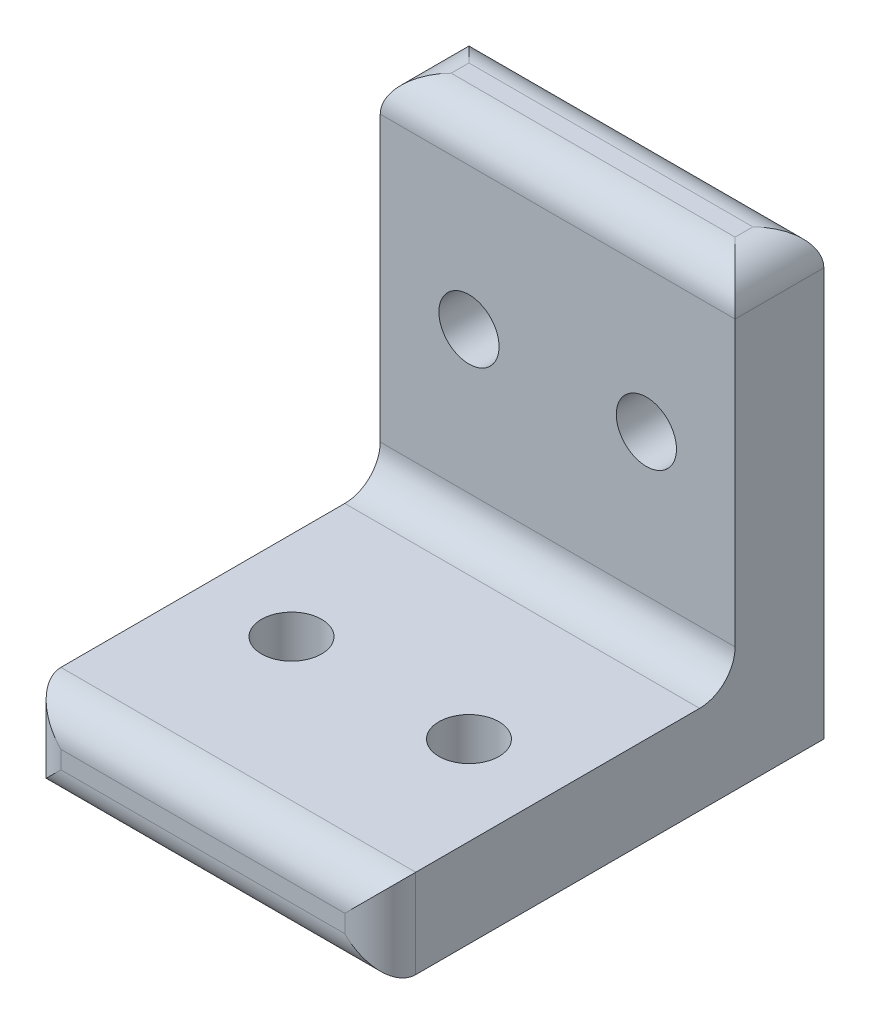
ISO-10303-21;
HEADER;
FILE_DESCRIPTION(('STEP AP214'),'2;1');
FILE_NAME('part.step','',(''),(''),'','','');
FILE_SCHEMA(('AUTOMOTIVE_DESIGN { 1 0 10303 214 1 1 1 1 }'));
ENDSEC;
DATA;
#1=APPLICATION_CONTEXT('core data for automotive mechanical design processes');
#2=APPLICATION_PROTOCOL_DEFINITION('international standard','automotive_design',2000,#1);
#3=PRODUCT_CONTEXT('',#1,'mechanical');
#4=PRODUCT('Part','Part','',(#3));
#5=PRODUCT_RELATED_PRODUCT_CATEGORY('part','',(#4));
#6=PRODUCT_DEFINITION_FORMATION('','',#4);
#7=PRODUCT_DEFINITION_CONTEXT('part definition',#1,'design');
#8=PRODUCT_DEFINITION('design','',#6,#7);
#9=PRODUCT_DEFINITION_SHAPE('','',#8);
#10=(LENGTH_UNIT() NAMED_UNIT(*) SI_UNIT(.MILLI.,.METRE.));
#11=(NAMED_UNIT(*) PLANE_ANGLE_UNIT() SI_UNIT($,.RADIAN.));
#12=(NAMED_UNIT(*) SI_UNIT($,.STERADIAN.) SOLID_ANGLE_UNIT());
#13=UNCERTAINTY_MEASURE_WITH_UNIT(LENGTH_MEASURE(1.E-05),#10,'distance_accuracy_value','');
#14=(GEOMETRIC_REPRESENTATION_CONTEXT(3) GLOBAL_UNCERTAINTY_ASSIGNED_CONTEXT((#13)) GLOBAL_UNIT_ASSIGNED_CONTEXT((#10,
#11,#12)) REPRESENTATION_CONTEXT('',''));
#15=CARTESIAN_POINT('',(0.,0.,0.));
#16=DIRECTION('',(0.,0.,1.));
#17=DIRECTION('',(1.,0.,0.));
#18=AXIS2_PLACEMENT_3D('',#15,#16,#17);
#19=CARTESIAN_POINT('',(0.,0.,0.));
#20=DIRECTION('',(0.,-1.,0.));
#21=DIRECTION('',(0.,0.,-1.));
#22=AXIS2_PLACEMENT_3D('',#19,#20,#21);
#23=PLANE('',#22);
#24=DIRECTION('',(0.,0.,-1.));
#25=VECTOR('',#24,1.);
#26=CARTESIAN_POINT('',(12.7,0.,12.7));
#27=LINE('',#26,#25);
#28=CARTESIAN_POINT('',(12.7,0.,10.16));
#29=VERTEX_POINT('',#28);
#30=CARTESIAN_POINT('',(12.7,0.,-19.05));
#31=VERTEX_POINT('',#30);
#32=EDGE_CURVE('E139',#29,#31,#27,.T.);
#33=ORIENTED_EDGE('',*,*,#32,.F.);
#34=DIRECTION('',(1.,0.,0.));
#35=VECTOR('',#34,1.);
#36=CARTESIAN_POINT('',(-12.7,0.,10.16));
#37=LINE('',#36,#35);
#38=CARTESIAN_POINT('',(-12.7,0.,10.16));
#39=VERTEX_POINT('',#38);
#40=EDGE_CURVE('E197',#29,#39,#37,.F.);
#41=ORIENTED_EDGE('',*,*,#40,.T.);
#42=DIRECTION('',(0.,0.,1.));
#43=VECTOR('',#42,1.);
#44=CARTESIAN_POINT('',(-12.7,0.,12.7));
#45=LINE('',#44,#43);
#46=CARTESIAN_POINT('',(-12.7,0.,-19.05));
#47=VERTEX_POINT('',#46);
#48=EDGE_CURVE('E146',#47,#39,#45,.T.);
#49=ORIENTED_EDGE('',*,*,#48,.F.);
#50=DIRECTION('',(-1.,0.,0.));
#51=VECTOR('',#50,1.);
#52=CARTESIAN_POINT('',(12.7,0.,-19.05));
#53=LINE('',#52,#51);
#54=EDGE_CURVE('E130',#31,#47,#53,.T.);
#55=ORIENTED_EDGE('',*,*,#54,.F.);
#56=EDGE_LOOP('',(#33,#41,#49,#55));
#57=FACE_BOUND('',#56,.T.);
#58=CARTESIAN_POINT('',(6.35,0.,0.));
#59=DIRECTION('',(0.,1.,0.));
#60=DIRECTION('',(0.,0.,1.));
#61=AXIS2_PLACEMENT_3D('',#58,#59,#60);
#62=CIRCLE('',#61,2.15265);
#63=CARTESIAN_POINT('',(6.35,0.,2.15265));
#64=VERTEX_POINT('',#63);
#65=EDGE_CURVE('E216',#64,#64,#62,.T.);
#66=ORIENTED_EDGE('',*,*,#65,.T.);
#67=EDGE_LOOP('',(#66));
#68=FACE_BOUND('',#67,.T.);
#69=CARTESIAN_POINT('',(-6.35,0.,0.));
#70=DIRECTION('',(0.,1.,0.));
#71=DIRECTION('',(0.,0.,1.));
#72=AXIS2_PLACEMENT_3D('',#69,#70,#71);
#73=CIRCLE('',#72,2.15265);
#74=CARTESIAN_POINT('',(-6.35,0.,2.15265));
#75=VERTEX_POINT('',#74);
#76=EDGE_CURVE('E301',#75,#75,#73,.T.);
#77=ORIENTED_EDGE('',*,*,#76,.T.);
#78=EDGE_LOOP('',(#77));
#79=FACE_BOUND('',#78,.T.);
#80=ADVANCED_FACE('F39',(#57,#68,#79),#23,.T.);
#81=CARTESIAN_POINT('',(12.7,6.35,12.7));
#82=DIRECTION('',(-1.,0.,0.));
#83=DIRECTION('',(0.,0.,1.));
#84=AXIS2_PLACEMENT_3D('',#81,#82,#83);
#85=PLANE('',#84);
#86=DIRECTION('',(0.,-1.,0.));
#87=VECTOR('',#86,1.);
#88=CARTESIAN_POINT('',(12.7,31.75,-19.05));
#89=LINE('',#88,#87);
#90=CARTESIAN_POINT('',(12.7,29.21,-19.05));
#91=VERTEX_POINT('',#90);
#92=EDGE_CURVE('E125',#91,#31,#89,.T.);
#93=ORIENTED_EDGE('',*,*,#92,.F.);
#94=DIRECTION('',(0.,0.,1.));
#95=VECTOR('',#94,1.);
#96=CARTESIAN_POINT('',(12.7,29.21,12.7));
#97=LINE('',#96,#95);
#98=CARTESIAN_POINT('',(12.7,29.21,-12.7));
#99=VERTEX_POINT('',#98);
#100=EDGE_CURVE('E183',#91,#99,#97,.T.);
#101=ORIENTED_EDGE('',*,*,#100,.T.);
#102=DIRECTION('',(0.,-1.,0.));
#103=VECTOR('',#102,1.);
#104=CARTESIAN_POINT('',(12.7,31.75,-12.7));
#105=LINE('',#104,#103);
#106=CARTESIAN_POINT('',(12.7,8.89,-12.7));
#107=VERTEX_POINT('',#106);
#108=EDGE_CURVE('E156',#99,#107,#105,.T.);
#109=ORIENTED_EDGE('',*,*,#108,.T.);
#110=CARTESIAN_POINT('',(12.7,8.89,-10.16));
#111=DIRECTION('',(-1.,0.,0.));
#112=DIRECTION('',(0.,0.,1.));
#113=AXIS2_PLACEMENT_3D('',#110,#111,#112);
#114=CIRCLE('',#113,2.54);
#115=CARTESIAN_POINT('',(12.7,6.35,-10.16));
#116=VERTEX_POINT('',#115);
#117=EDGE_CURVE('E11',#107,#116,#114,.T.);
#118=ORIENTED_EDGE('',*,*,#117,.T.);
#119=DIRECTION('',(0.,0.,-1.));
#120=VECTOR('',#119,1.);
#121=CARTESIAN_POINT('',(12.7,6.35,12.7));
#122=LINE('',#121,#120);
#123=CARTESIAN_POINT('',(12.7,6.35,10.16));
#124=VERTEX_POINT('',#123);
#125=EDGE_CURVE('E160',#124,#116,#122,.T.);
#126=ORIENTED_EDGE('',*,*,#125,.F.);
#127=DIRECTION('',(0.,-1.,0.));
#128=VECTOR('',#127,1.);
#129=CARTESIAN_POINT('',(12.7,6.35,10.16));
#130=LINE('',#129,#128);
#131=EDGE_CURVE('E143',#124,#29,#130,.T.);
#132=ORIENTED_EDGE('',*,*,#131,.T.);
#133=ORIENTED_EDGE('',*,*,#32,.T.);
#134=EDGE_LOOP('',(#93,#101,#109,#118,#126,#132,#133));
#135=FACE_BOUND('',#134,.T.);
#136=ADVANCED_FACE('F140',(#135),#85,.F.);
#137=CARTESIAN_POINT('',(-12.7,6.35,12.7));
#138=DIRECTION('',(1.,0.,0.));
#139=DIRECTION('',(0.,0.,-1.));
#140=AXIS2_PLACEMENT_3D('',#137,#138,#139);
#141=PLANE('',#140);
#142=DIRECTION('',(0.,1.,0.));
#143=VECTOR('',#142,1.);
#144=CARTESIAN_POINT('',(-12.7,31.75,-12.7));
#145=LINE('',#144,#143);
#146=CARTESIAN_POINT('',(-12.7,8.89,-12.7));
#147=VERTEX_POINT('',#146);
#148=CARTESIAN_POINT('',(-12.7,29.21,-12.7));
#149=VERTEX_POINT('',#148);
#150=EDGE_CURVE('E153',#147,#149,#145,.T.);
#151=ORIENTED_EDGE('',*,*,#150,.T.);
#152=DIRECTION('',(0.,0.,1.));
#153=VECTOR('',#152,1.);
#154=CARTESIAN_POINT('',(-12.7,29.21,12.7));
#155=LINE('',#154,#153);
#156=CARTESIAN_POINT('',(-12.7,29.21,-19.05));
#157=VERTEX_POINT('',#156);
#158=EDGE_CURVE('E179',#149,#157,#155,.F.);
#159=ORIENTED_EDGE('',*,*,#158,.T.);
#160=DIRECTION('',(0.,1.,0.));
#161=VECTOR('',#160,1.);
#162=CARTESIAN_POINT('',(-12.7,31.75,-19.05));
#163=LINE('',#162,#161);
#164=EDGE_CURVE('E136',#47,#157,#163,.T.);
#165=ORIENTED_EDGE('',*,*,#164,.F.);
#166=ORIENTED_EDGE('',*,*,#48,.T.);
#167=DIRECTION('',(0.,-1.,0.));
#168=VECTOR('',#167,1.);
#169=CARTESIAN_POINT('',(-12.7,6.35,10.16));
#170=LINE('',#169,#168);
#171=CARTESIAN_POINT('',(-12.7,6.35,10.16));
#172=VERTEX_POINT('',#171);
#173=EDGE_CURVE('E176',#39,#172,#170,.F.);
#174=ORIENTED_EDGE('',*,*,#173,.T.);
#175=DIRECTION('',(0.,0.,1.));
#176=VECTOR('',#175,1.);
#177=CARTESIAN_POINT('',(-12.7,6.35,12.7));
#178=LINE('',#177,#176);
#179=CARTESIAN_POINT('',(-12.7,6.35,-10.16));
#180=VERTEX_POINT('',#179);
#181=EDGE_CURVE('E163',#180,#172,#178,.T.);
#182=ORIENTED_EDGE('',*,*,#181,.F.);
#183=CARTESIAN_POINT('',(-12.7,8.89,-10.16));
#184=DIRECTION('',(1.,0.,0.));
#185=DIRECTION('',(0.,0.,-1.));
#186=AXIS2_PLACEMENT_3D('',#183,#184,#185);
#187=CIRCLE('',#186,2.54);
#188=EDGE_CURVE('E48',#180,#147,#187,.T.);
#189=ORIENTED_EDGE('',*,*,#188,.T.);
#190=EDGE_LOOP('',(#151,#159,#165,#166,#174,#182,#189));
#191=FACE_BOUND('',#190,.T.);
#192=ADVANCED_FACE('F232',(#191),#141,.F.);
#193=CARTESIAN_POINT('',(-12.7,6.35,12.7));
#194=DIRECTION('',(0.,0.,-1.));
#195=DIRECTION('',(-1.,0.,0.));
#196=AXIS2_PLACEMENT_3D('',#193,#194,#195);
#197=PLANE('',#196);
#198=DIRECTION('',(0.,-1.,0.));
#199=VECTOR('',#198,1.);
#200=CARTESIAN_POINT('',(-10.16,6.35,12.7));
#201=LINE('',#200,#199);
#202=CARTESIAN_POINT('',(-10.16,3.81,12.7));
#203=VERTEX_POINT('',#202);
#204=CARTESIAN_POINT('',(-10.16,2.54,12.7));
#205=VERTEX_POINT('',#204);
#206=EDGE_CURVE('E189',#203,#205,#201,.T.);
#207=ORIENTED_EDGE('',*,*,#206,.T.);
#208=DIRECTION('',(1.,0.,0.));
#209=VECTOR('',#208,1.);
#210=CARTESIAN_POINT('',(12.7,2.54,12.7));
#211=LINE('',#210,#209);
#212=CARTESIAN_POINT('',(10.16,2.54,12.7));
#213=VERTEX_POINT('',#212);
#214=EDGE_CURVE('E63',#205,#213,#211,.T.);
#215=ORIENTED_EDGE('',*,*,#214,.T.);
#216=DIRECTION('',(0.,-1.,0.));
#217=VECTOR('',#216,1.);
#218=CARTESIAN_POINT('',(10.16,6.35,12.7));
#219=LINE('',#218,#217);
#220=CARTESIAN_POINT('',(10.16,3.81,12.7));
#221=VERTEX_POINT('',#220);
#222=EDGE_CURVE('E187',#213,#221,#219,.F.);
#223=ORIENTED_EDGE('',*,*,#222,.T.);
#224=DIRECTION('',(1.,0.,0.));
#225=VECTOR('',#224,1.);
#226=CARTESIAN_POINT('',(-12.7,3.81,12.7));
#227=LINE('',#226,#225);
#228=EDGE_CURVE('E185',#221,#203,#227,.F.);
#229=ORIENTED_EDGE('',*,*,#228,.T.);
#230=EDGE_LOOP('',(#207,#215,#223,#229));
#231=FACE_BOUND('',#230,.T.);
#232=ADVANCED_FACE('F235',(#231),#197,.F.);
#233=CARTESIAN_POINT('',(0.,6.35,0.));
#234=DIRECTION('',(0.,-1.,0.));
#235=DIRECTION('',(0.,0.,-1.));
#236=AXIS2_PLACEMENT_3D('',#233,#234,#235);
#237=PLANE('',#236);
#238=CARTESIAN_POINT('',(-6.35,6.35,0.));
#239=DIRECTION('',(0.,1.,0.));
#240=DIRECTION('',(0.,0.,1.));
#241=AXIS2_PLACEMENT_3D('',#238,#239,#240);
#242=CIRCLE('',#241,2.15265);
#243=CARTESIAN_POINT('',(-6.35,6.35,2.15265));
#244=VERTEX_POINT('',#243);
#245=EDGE_CURVE('E298',#244,#244,#242,.T.);
#246=ORIENTED_EDGE('',*,*,#245,.F.);
#247=EDGE_LOOP('',(#246));
#248=FACE_BOUND('',#247,.T.);
#249=CARTESIAN_POINT('',(6.35,6.35,0.));
#250=DIRECTION('',(0.,1.,0.));
#251=DIRECTION('',(0.,0.,1.));
#252=AXIS2_PLACEMENT_3D('',#249,#250,#251);
#253=CIRCLE('',#252,2.15265);
#254=CARTESIAN_POINT('',(6.35,6.35,2.15265));
#255=VERTEX_POINT('',#254);
#256=EDGE_CURVE('E304',#255,#255,#253,.T.);
#257=ORIENTED_EDGE('',*,*,#256,.F.);
#258=EDGE_LOOP('',(#257));
#259=FACE_BOUND('',#258,.T.);
#260=ORIENTED_EDGE('',*,*,#181,.T.);
#261=DIRECTION('',(1.,0.,0.));
#262=VECTOR('',#261,1.);
#263=CARTESIAN_POINT('',(0.,6.35,10.16));
#264=LINE('',#263,#262);
#265=EDGE_CURVE('E202',#172,#124,#264,.T.);
#266=ORIENTED_EDGE('',*,*,#265,.T.);
#267=ORIENTED_EDGE('',*,*,#125,.T.);
#268=DIRECTION('',(-1.,0.,0.));
#269=VECTOR('',#268,1.);
#270=CARTESIAN_POINT('',(-12.7,6.35,-10.16));
#271=LINE('',#270,#269);
#272=EDGE_CURVE('E199',#116,#180,#271,.T.);
#273=ORIENTED_EDGE('',*,*,#272,.T.);
#274=EDGE_LOOP('',(#260,#266,#267,#273));
#275=FACE_BOUND('',#274,.T.);
#276=ADVANCED_FACE('F237',(#248,#259,#275),#237,.F.);
#277=CARTESIAN_POINT('',(12.7,31.75,-19.05));
#278=DIRECTION('',(0.,-1.,0.));
#279=DIRECTION('',(0.,0.,-1.));
#280=AXIS2_PLACEMENT_3D('',#277,#278,#279);
#281=PLANE('',#280);
#282=DIRECTION('',(0.,0.,1.));
#283=VECTOR('',#282,1.);
#284=CARTESIAN_POINT('',(10.16,31.75,-19.05));
#285=LINE('',#284,#283);
#286=CARTESIAN_POINT('',(10.16,31.75,-15.24));
#287=VERTEX_POINT('',#286);
#288=CARTESIAN_POINT('',(10.16,31.75,-16.51));
#289=VERTEX_POINT('',#288);
#290=EDGE_CURVE('E169',#287,#289,#285,.F.);
#291=ORIENTED_EDGE('',*,*,#290,.T.);
#292=DIRECTION('',(1.,0.,0.));
#293=VECTOR('',#292,1.);
#294=CARTESIAN_POINT('',(-12.7,31.75,-16.51));
#295=LINE('',#294,#293);
#296=CARTESIAN_POINT('',(-10.16,31.75,-16.51));
#297=VERTEX_POINT('',#296);
#298=EDGE_CURVE('E174',#289,#297,#295,.F.);
#299=ORIENTED_EDGE('',*,*,#298,.T.);
#300=DIRECTION('',(0.,0.,1.));
#301=VECTOR('',#300,1.);
#302=CARTESIAN_POINT('',(-10.16,31.75,-19.05));
#303=LINE('',#302,#301);
#304=CARTESIAN_POINT('',(-10.16,31.75,-15.24));
#305=VERTEX_POINT('',#304);
#306=EDGE_CURVE('E171',#297,#305,#303,.T.);
#307=ORIENTED_EDGE('',*,*,#306,.T.);
#308=DIRECTION('',(1.,0.,0.));
#309=VECTOR('',#308,1.);
#310=CARTESIAN_POINT('',(12.7,31.75,-15.24));
#311=LINE('',#310,#309);
#312=EDGE_CURVE('E165',#305,#287,#311,.T.);
#313=ORIENTED_EDGE('',*,*,#312,.T.);
#314=EDGE_LOOP('',(#291,#299,#307,#313));
#315=FACE_BOUND('',#314,.T.);
#316=ADVANCED_FACE('F243',(#315),#281,.F.);
#317=CARTESIAN_POINT('',(0.,0.,-19.05));
#318=DIRECTION('',(0.,0.,-1.));
#319=DIRECTION('',(-1.,0.,0.));
#320=AXIS2_PLACEMENT_3D('',#317,#318,#319);
#321=PLANE('',#320);
#322=CARTESIAN_POINT('',(6.35,19.05,-19.05));
#323=DIRECTION('',(0.,0.,1.));
#324=DIRECTION('',(1.,0.,0.));
#325=AXIS2_PLACEMENT_3D('',#322,#323,#324);
#326=CIRCLE('',#325,2.15265);
#327=CARTESIAN_POINT('',(8.50265,19.05,-19.05));
#328=VERTEX_POINT('',#327);
#329=EDGE_CURVE('E285',#328,#328,#326,.T.);
#330=ORIENTED_EDGE('',*,*,#329,.T.);
#331=EDGE_LOOP('',(#330));
#332=FACE_BOUND('',#331,.T.);
#333=CARTESIAN_POINT('',(-6.35,19.05,-19.05));
#334=DIRECTION('',(0.,0.,1.));
#335=DIRECTION('',(1.,0.,0.));
#336=AXIS2_PLACEMENT_3D('',#333,#334,#335);
#337=CIRCLE('',#336,2.15265);
#338=CARTESIAN_POINT('',(-4.19735,19.05,-19.05));
#339=VERTEX_POINT('',#338);
#340=EDGE_CURVE('E295',#339,#339,#337,.T.);
#341=ORIENTED_EDGE('',*,*,#340,.T.);
#342=EDGE_LOOP('',(#341));
#343=FACE_BOUND('',#342,.T.);
#344=ORIENTED_EDGE('',*,*,#164,.T.);
#345=DIRECTION('',(1.,0.,0.));
#346=VECTOR('',#345,1.);
#347=CARTESIAN_POINT('',(12.7,29.21,-19.05));
#348=LINE('',#347,#346);
#349=EDGE_CURVE('E133',#157,#91,#348,.T.);
#350=ORIENTED_EDGE('',*,*,#349,.T.);
#351=ORIENTED_EDGE('',*,*,#92,.T.);
#352=ORIENTED_EDGE('',*,*,#54,.T.);
#353=EDGE_LOOP('',(#344,#350,#351,#352));
#354=FACE_BOUND('',#353,.T.);
#355=ADVANCED_FACE('F128',(#332,#343,#354),#321,.T.);
#356=CARTESIAN_POINT('',(0.,0.,-12.7));
#357=DIRECTION('',(0.,0.,-1.));
#358=DIRECTION('',(-1.,0.,0.));
#359=AXIS2_PLACEMENT_3D('',#356,#357,#358);
#360=PLANE('',#359);
#361=CARTESIAN_POINT('',(6.35,19.05,-12.7));
#362=DIRECTION('',(0.,0.,1.));
#363=DIRECTION('',(1.,0.,0.));
#364=AXIS2_PLACEMENT_3D('',#361,#362,#363);
#365=CIRCLE('',#364,2.15265);
#366=CARTESIAN_POINT('',(8.50265,19.05,-12.7));
#367=VERTEX_POINT('',#366);
#368=EDGE_CURVE('E288',#367,#367,#365,.T.);
#369=ORIENTED_EDGE('',*,*,#368,.F.);
#370=EDGE_LOOP('',(#369));
#371=FACE_BOUND('',#370,.T.);
#372=CARTESIAN_POINT('',(-6.35,19.05,-12.7));
#373=DIRECTION('',(0.,0.,1.));
#374=DIRECTION('',(1.,0.,0.));
#375=AXIS2_PLACEMENT_3D('',#372,#373,#374);
#376=CIRCLE('',#375,2.15265);
#377=CARTESIAN_POINT('',(-4.19735,19.05,-12.7));
#378=VERTEX_POINT('',#377);
#379=EDGE_CURVE('E290',#378,#378,#376,.T.);
#380=ORIENTED_EDGE('',*,*,#379,.F.);
#381=EDGE_LOOP('',(#380));
#382=FACE_BOUND('',#381,.T.);
#383=ORIENTED_EDGE('',*,*,#108,.F.);
#384=DIRECTION('',(1.,0.,0.));
#385=VECTOR('',#384,1.);
#386=CARTESIAN_POINT('',(0.,29.21,-12.7));
#387=LINE('',#386,#385);
#388=EDGE_CURVE('E195',#99,#149,#387,.F.);
#389=ORIENTED_EDGE('',*,*,#388,.T.);
#390=ORIENTED_EDGE('',*,*,#150,.F.);
#391=DIRECTION('',(-1.,0.,0.));
#392=VECTOR('',#391,1.);
#393=CARTESIAN_POINT('',(12.7,8.89,-12.7));
#394=LINE('',#393,#392);
#395=EDGE_CURVE('E193',#147,#107,#394,.F.);
#396=ORIENTED_EDGE('',*,*,#395,.T.);
#397=EDGE_LOOP('',(#383,#389,#390,#396));
#398=FACE_BOUND('',#397,.T.);
#399=ADVANCED_FACE('F257',(#371,#382,#398),#360,.F.);
#400=CARTESIAN_POINT('',(10.16,29.21,12.7));
#401=DIRECTION('',(0.,0.,1.));
#402=DIRECTION('',(1.,0.,0.));
#403=AXIS2_PLACEMENT_3D('',#400,#401,#402);
#404=CYLINDRICAL_SURFACE('',#403,2.54);
#405=CARTESIAN_POINT('',(10.16,29.21,-15.24));
#406=DIRECTION('',(0.707106781186547,0.,-0.707106781186547));
#407=DIRECTION('',(0.707106781186547,0.,0.707106781186547));
#408=AXIS2_PLACEMENT_3D('',#405,#406,#407);
#409=ELLIPSE('',#408,3.59210244842766,2.54);
#410=EDGE_CURVE('E209',#99,#287,#409,.F.);
#411=ORIENTED_EDGE('',*,*,#410,.F.);
#412=ORIENTED_EDGE('',*,*,#100,.F.);
#413=CARTESIAN_POINT('',(10.16,29.21,-16.51));
#414=DIRECTION('',(-0.707106781186547,0.,-0.707106781186547));
#415=DIRECTION('',(-0.707106781186547,0.,0.707106781186547));
#416=AXIS2_PLACEMENT_3D('',#413,#414,#415);
#417=ELLIPSE('',#416,3.59210244842766,2.54);
#418=EDGE_CURVE('E157',#289,#91,#417,.T.);
#419=ORIENTED_EDGE('',*,*,#418,.F.);
#420=ORIENTED_EDGE('',*,*,#290,.F.);
#421=EDGE_LOOP('',(#411,#412,#419,#420));
#422=FACE_BOUND('',#421,.T.);
#423=ADVANCED_FACE('F260',(#422),#404,.T.);
#424=CARTESIAN_POINT('',(0.,29.21,-16.51));
#425=DIRECTION('',(-1.,0.,0.));
#426=DIRECTION('',(0.,0.,1.));
#427=AXIS2_PLACEMENT_3D('',#424,#425,#426);
#428=CYLINDRICAL_SURFACE('',#427,2.54);
#429=ORIENTED_EDGE('',*,*,#418,.T.);
#430=ORIENTED_EDGE('',*,*,#349,.F.);
#431=CARTESIAN_POINT('',(-10.16,29.21,-16.51));
#432=DIRECTION('',(-0.707106781186547,0.,0.707106781186547));
#433=DIRECTION('',(-0.707106781186547,0.,-0.707106781186547));
#434=AXIS2_PLACEMENT_3D('',#431,#432,#433);
#435=ELLIPSE('',#434,3.59210244842766,2.54);
#436=EDGE_CURVE('E207',#297,#157,#435,.T.);
#437=ORIENTED_EDGE('',*,*,#436,.F.);
#438=ORIENTED_EDGE('',*,*,#298,.F.);
#439=EDGE_LOOP('',(#429,#430,#437,#438));
#440=FACE_BOUND('',#439,.T.);
#441=ADVANCED_FACE('F337',(#440),#428,.T.);
#442=CARTESIAN_POINT('',(12.7,29.21,-15.24));
#443=DIRECTION('',(1.,0.,0.));
#444=DIRECTION('',(0.,0.,-1.));
#445=AXIS2_PLACEMENT_3D('',#442,#443,#444);
#446=CYLINDRICAL_SURFACE('',#445,2.54);
#447=ORIENTED_EDGE('',*,*,#410,.T.);
#448=ORIENTED_EDGE('',*,*,#312,.F.);
#449=CARTESIAN_POINT('',(-10.16,29.21,-15.24));
#450=DIRECTION('',(0.707106781186547,0.,0.707106781186547));
#451=DIRECTION('',(0.707106781186547,0.,-0.707106781186547));
#452=AXIS2_PLACEMENT_3D('',#449,#450,#451);
#453=ELLIPSE('',#452,3.59210244842766,2.54);
#454=EDGE_CURVE('E205',#149,#305,#453,.F.);
#455=ORIENTED_EDGE('',*,*,#454,.F.);
#456=ORIENTED_EDGE('',*,*,#388,.F.);
#457=EDGE_LOOP('',(#447,#448,#455,#456));
#458=FACE_BOUND('',#457,.T.);
#459=ADVANCED_FACE('F330',(#458),#446,.T.);
#460=CARTESIAN_POINT('',(-10.16,29.21,-19.05));
#461=DIRECTION('',(0.,0.,1.));
#462=DIRECTION('',(1.,0.,0.));
#463=AXIS2_PLACEMENT_3D('',#460,#461,#462);
#464=CYLINDRICAL_SURFACE('',#463,2.54);
#465=ORIENTED_EDGE('',*,*,#436,.T.);
#466=ORIENTED_EDGE('',*,*,#158,.F.);
#467=ORIENTED_EDGE('',*,*,#454,.T.);
#468=ORIENTED_EDGE('',*,*,#306,.F.);
#469=EDGE_LOOP('',(#465,#466,#467,#468));
#470=FACE_BOUND('',#469,.T.);
#471=ADVANCED_FACE('F333',(#470),#464,.T.);
#472=CARTESIAN_POINT('',(10.16,6.35,10.16));
#473=DIRECTION('',(0.,-1.,0.));
#474=DIRECTION('',(0.,0.,-1.));
#475=AXIS2_PLACEMENT_3D('',#472,#473,#474);
#476=CYLINDRICAL_SURFACE('',#475,2.54);
#477=CARTESIAN_POINT('',(10.16,2.54,10.16));
#478=DIRECTION('',(-0.707106781186547,-0.707106781186547,0.));
#479=DIRECTION('',(-0.707106781186547,0.707106781186547,0.));
#480=AXIS2_PLACEMENT_3D('',#477,#478,#479);
#481=ELLIPSE('',#480,3.59210244842766,2.54);
#482=EDGE_CURVE('E217',#29,#213,#481,.T.);
#483=ORIENTED_EDGE('',*,*,#482,.F.);
#484=ORIENTED_EDGE('',*,*,#131,.F.);
#485=CARTESIAN_POINT('',(10.16,3.81,10.16));
#486=DIRECTION('',(0.707106781186547,-0.707106781186547,0.));
#487=DIRECTION('',(0.707106781186547,0.707106781186547,0.));
#488=AXIS2_PLACEMENT_3D('',#485,#486,#487);
#489=ELLIPSE('',#488,3.59210244842766,2.54);
#490=EDGE_CURVE('E43',#221,#124,#489,.F.);
#491=ORIENTED_EDGE('',*,*,#490,.F.);
#492=ORIENTED_EDGE('',*,*,#222,.F.);
#493=EDGE_LOOP('',(#483,#484,#491,#492));
#494=FACE_BOUND('',#493,.T.);
#495=ADVANCED_FACE('F229',(#494),#476,.T.);
#496=CARTESIAN_POINT('',(0.,3.81,10.16));
#497=DIRECTION('',(1.,0.,0.));
#498=DIRECTION('',(0.,0.,-1.));
#499=AXIS2_PLACEMENT_3D('',#496,#497,#498);
#500=CYLINDRICAL_SURFACE('',#499,2.54);
#501=ORIENTED_EDGE('',*,*,#490,.T.);
#502=ORIENTED_EDGE('',*,*,#265,.F.);
#503=CARTESIAN_POINT('',(-10.16,3.81,10.16));
#504=DIRECTION('',(0.707106781186547,0.707106781186547,0.));
#505=DIRECTION('',(0.707106781186547,-0.707106781186547,0.));
#506=AXIS2_PLACEMENT_3D('',#503,#504,#505);
#507=ELLIPSE('',#506,3.59210244842766,2.54);
#508=EDGE_CURVE('E215',#203,#172,#507,.F.);
#509=ORIENTED_EDGE('',*,*,#508,.F.);
#510=ORIENTED_EDGE('',*,*,#228,.F.);
#511=EDGE_LOOP('',(#501,#502,#509,#510));
#512=FACE_BOUND('',#511,.T.);
#513=ADVANCED_FACE('F226',(#512),#500,.T.);
#514=CARTESIAN_POINT('',(-12.7,2.54,10.16));
#515=DIRECTION('',(-1.,0.,0.));
#516=DIRECTION('',(0.,0.,1.));
#517=AXIS2_PLACEMENT_3D('',#514,#515,#516);
#518=CYLINDRICAL_SURFACE('',#517,2.54);
#519=ORIENTED_EDGE('',*,*,#482,.T.);
#520=ORIENTED_EDGE('',*,*,#214,.F.);
#521=CARTESIAN_POINT('',(-10.16,2.54,10.16));
#522=DIRECTION('',(-0.707106781186547,0.707106781186547,0.));
#523=DIRECTION('',(-0.707106781186547,-0.707106781186547,0.));
#524=AXIS2_PLACEMENT_3D('',#521,#522,#523);
#525=ELLIPSE('',#524,3.59210244842766,2.54);
#526=EDGE_CURVE('E56',#39,#205,#525,.T.);
#527=ORIENTED_EDGE('',*,*,#526,.F.);
#528=ORIENTED_EDGE('',*,*,#40,.F.);
#529=EDGE_LOOP('',(#519,#520,#527,#528));
#530=FACE_BOUND('',#529,.T.);
#531=ADVANCED_FACE('F230',(#530),#518,.T.);
#532=CARTESIAN_POINT('',(-10.16,6.35,10.16));
#533=DIRECTION('',(0.,-1.,0.));
#534=DIRECTION('',(0.,0.,-1.));
#535=AXIS2_PLACEMENT_3D('',#532,#533,#534);
#536=CYLINDRICAL_SURFACE('',#535,2.54);
#537=ORIENTED_EDGE('',*,*,#508,.T.);
#538=ORIENTED_EDGE('',*,*,#173,.F.);
#539=ORIENTED_EDGE('',*,*,#526,.T.);
#540=ORIENTED_EDGE('',*,*,#206,.F.);
#541=EDGE_LOOP('',(#537,#538,#539,#540));
#542=FACE_BOUND('',#541,.T.);
#543=ADVANCED_FACE('F234',(#542),#536,.T.);
#544=CARTESIAN_POINT('',(0.,8.89,-10.16));
#545=DIRECTION('',(1.,0.,0.));
#546=DIRECTION('',(0.,0.,-1.));
#547=AXIS2_PLACEMENT_3D('',#544,#545,#546);
#548=CYLINDRICAL_SURFACE('',#547,2.54);
#549=ORIENTED_EDGE('',*,*,#117,.F.);
#550=ORIENTED_EDGE('',*,*,#395,.F.);
#551=ORIENTED_EDGE('',*,*,#188,.F.);
#552=ORIENTED_EDGE('',*,*,#272,.F.);
#553=EDGE_LOOP('',(#549,#550,#551,#552));
#554=FACE_BOUND('',#553,.T.);
#555=ADVANCED_FACE('F41',(#554),#548,.F.);
#556=CARTESIAN_POINT('',(6.35,6.35,0.));
#557=DIRECTION('',(0.,1.,0.));
#558=DIRECTION('',(0.,0.,1.));
#559=AXIS2_PLACEMENT_3D('',#556,#557,#558);
#560=CYLINDRICAL_SURFACE('',#559,2.15265);
#561=ORIENTED_EDGE('',*,*,#65,.F.);
#562=EDGE_LOOP('',(#561));
#563=FACE_BOUND('',#562,.T.);
#564=ORIENTED_EDGE('',*,*,#256,.T.);
#565=EDGE_LOOP('',(#564));
#566=FACE_BOUND('',#565,.T.);
#567=ADVANCED_FACE('F265',(#563,#566),#560,.F.);
#568=CARTESIAN_POINT('',(-6.35,6.35,0.));
#569=DIRECTION('',(0.,1.,0.));
#570=DIRECTION('',(0.,0.,1.));
#571=AXIS2_PLACEMENT_3D('',#568,#569,#570);
#572=CYLINDRICAL_SURFACE('',#571,2.15265);
#573=ORIENTED_EDGE('',*,*,#76,.F.);
#574=EDGE_LOOP('',(#573));
#575=FACE_BOUND('',#574,.T.);
#576=ORIENTED_EDGE('',*,*,#245,.T.);
#577=EDGE_LOOP('',(#576));
#578=FACE_BOUND('',#577,.T.);
#579=ADVANCED_FACE('F268',(#575,#578),#572,.F.);
#580=CARTESIAN_POINT('',(-6.35,19.05,-12.7));
#581=DIRECTION('',(0.,0.,1.));
#582=DIRECTION('',(1.,0.,0.));
#583=AXIS2_PLACEMENT_3D('',#580,#581,#582);
#584=CYLINDRICAL_SURFACE('',#583,2.15265);
#585=ORIENTED_EDGE('',*,*,#340,.F.);
#586=EDGE_LOOP('',(#585));
#587=FACE_BOUND('',#586,.T.);
#588=ORIENTED_EDGE('',*,*,#379,.T.);
#589=EDGE_LOOP('',(#588));
#590=FACE_BOUND('',#589,.T.);
#591=ADVANCED_FACE('F272',(#587,#590),#584,.F.);
#592=CARTESIAN_POINT('',(6.35,19.05,-12.7));
#593=DIRECTION('',(0.,0.,1.));
#594=DIRECTION('',(1.,0.,0.));
#595=AXIS2_PLACEMENT_3D('',#592,#593,#594);
#596=CYLINDRICAL_SURFACE('',#595,2.15265);
#597=ORIENTED_EDGE('',*,*,#329,.F.);
#598=EDGE_LOOP('',(#597));
#599=FACE_BOUND('',#598,.T.);
#600=ORIENTED_EDGE('',*,*,#368,.T.);
#601=EDGE_LOOP('',(#600));
#602=FACE_BOUND('',#601,.T.);
#603=ADVANCED_FACE('F276',(#599,#602),#596,.F.);
#604=CLOSED_SHELL('',(#80,#136,#192,#232,#276,#316,#355,#399,#423,#441,#459,#471,#495,#513,#531,
#543,#555,#567,#579,#591,#603));
#605=MANIFOLD_SOLID_BREP('B2',#604);
#606=ADVANCED_BREP_SHAPE_REPRESENTATION('',(#18,#605),#14);
#607=SHAPE_DEFINITION_REPRESENTATION(#9,#606);
ENDSEC;
END-ISO-10303-21;
